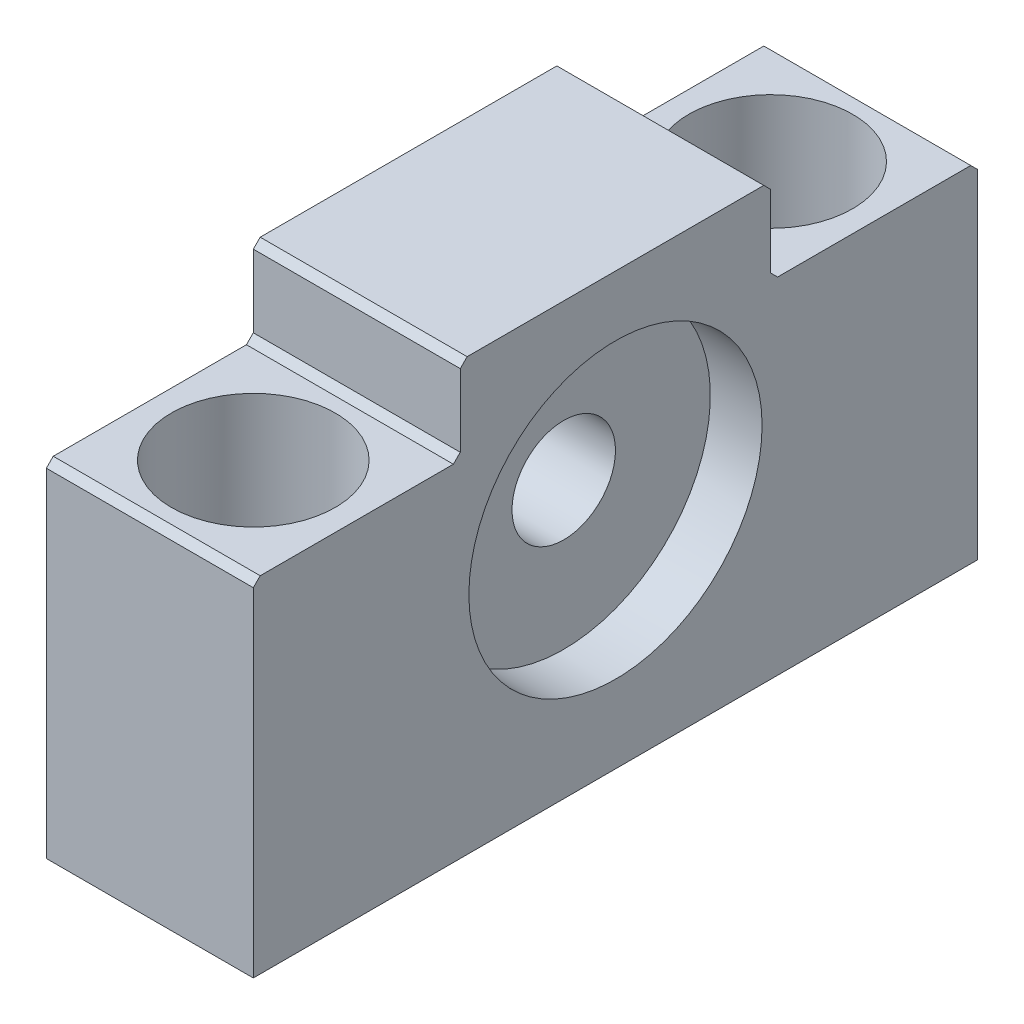
ISO-10303-21;
HEADER;
FILE_DESCRIPTION(('STEP AP214'),'2;1');
FILE_NAME('part.step','',(''),(''),'','','');
FILE_SCHEMA(('AUTOMOTIVE_DESIGN { 1 0 10303 214 1 1 1 1 }'));
ENDSEC;
DATA;
#1=APPLICATION_CONTEXT('core data for automotive mechanical design processes');
#2=APPLICATION_PROTOCOL_DEFINITION('international standard','automotive_design',2000,#1);
#3=PRODUCT_CONTEXT('',#1,'mechanical');
#4=PRODUCT('Part','Part','',(#3));
#5=PRODUCT_RELATED_PRODUCT_CATEGORY('part','',(#4));
#6=PRODUCT_DEFINITION_FORMATION('','',#4);
#7=PRODUCT_DEFINITION_CONTEXT('part definition',#1,'design');
#8=PRODUCT_DEFINITION('design','',#6,#7);
#9=PRODUCT_DEFINITION_SHAPE('','',#8);
#10=(LENGTH_UNIT() NAMED_UNIT(*) SI_UNIT(.MILLI.,.METRE.));
#11=(NAMED_UNIT(*) PLANE_ANGLE_UNIT() SI_UNIT($,.RADIAN.));
#12=(NAMED_UNIT(*) SI_UNIT($,.STERADIAN.) SOLID_ANGLE_UNIT());
#13=UNCERTAINTY_MEASURE_WITH_UNIT(LENGTH_MEASURE(1.E-05),#10,'distance_accuracy_value','');
#14=(GEOMETRIC_REPRESENTATION_CONTEXT(3) GLOBAL_UNCERTAINTY_ASSIGNED_CONTEXT((#13)) GLOBAL_UNIT_ASSIGNED_CONTEXT((#10,
#11,#12)) REPRESENTATION_CONTEXT('',''));
#15=CARTESIAN_POINT('',(0.,0.,0.));
#16=DIRECTION('',(0.,0.,1.));
#17=DIRECTION('',(1.,0.,0.));
#18=AXIS2_PLACEMENT_3D('',#15,#16,#17);
#19=CARTESIAN_POINT('',(0.,6.6,21.));
#20=DIRECTION('',(0.,0.707106781186548,0.707106781186547));
#21=DIRECTION('',(1.,0.,0.));
#22=AXIS2_PLACEMENT_3D('',#19,#20,#21);
#23=PLANE('',#22);
#24=DIRECTION('',(0.,-0.707106781186548,0.707106781186548));
#25=VECTOR('',#24,1.);
#26=CARTESIAN_POINT('',(0.,7.,20.6));
#27=LINE('',#26,#25);
#28=CARTESIAN_POINT('',(0.,7.,20.6));
#29=VERTEX_POINT('',#28);
#30=CARTESIAN_POINT('',(0.,6.6,21.));
#31=VERTEX_POINT('',#30);
#32=EDGE_CURVE('E120',#29,#31,#27,.T.);
#33=ORIENTED_EDGE('',*,*,#32,.T.);
#34=DIRECTION('',(1.,0.,0.));
#35=VECTOR('',#34,1.);
#36=CARTESIAN_POINT('',(0.,6.6,21.));
#37=LINE('',#36,#35);
#38=CARTESIAN_POINT('',(12.,6.6,21.));
#39=VERTEX_POINT('',#38);
#40=EDGE_CURVE('E134',#39,#31,#37,.F.);
#41=ORIENTED_EDGE('',*,*,#40,.F.);
#42=DIRECTION('',(0.,0.707106781186548,-0.707106781186548));
#43=VECTOR('',#42,1.);
#44=CARTESIAN_POINT('',(12.,6.6,21.));
#45=LINE('',#44,#43);
#46=CARTESIAN_POINT('',(12.,7.,20.6));
#47=VERTEX_POINT('',#46);
#48=EDGE_CURVE('E140',#47,#39,#45,.F.);
#49=ORIENTED_EDGE('',*,*,#48,.F.);
#50=DIRECTION('',(-1.,0.,0.));
#51=VECTOR('',#50,1.);
#52=CARTESIAN_POINT('',(12.,7.,20.6));
#53=LINE('',#52,#51);
#54=EDGE_CURVE('E128',#47,#29,#53,.T.);
#55=ORIENTED_EDGE('',*,*,#54,.T.);
#56=EDGE_LOOP('',(#33,#41,#49,#55));
#57=FACE_BOUND('',#56,.T.);
#58=ADVANCED_FACE('F17',(#57),#23,.T.);
#59=CARTESIAN_POINT('',(12.,-13.,21.));
#60=DIRECTION('',(0.,0.,1.));
#61=DIRECTION('',(0.,1.,0.));
#62=AXIS2_PLACEMENT_3D('',#59,#60,#61);
#63=PLANE('',#62);
#64=DIRECTION('',(0.,-1.,0.));
#65=VECTOR('',#64,1.);
#66=CARTESIAN_POINT('',(0.,6.6,21.));
#67=LINE('',#66,#65);
#68=CARTESIAN_POINT('',(0.,-13.,21.));
#69=VERTEX_POINT('',#68);
#70=EDGE_CURVE('E116',#31,#69,#67,.T.);
#71=ORIENTED_EDGE('',*,*,#70,.T.);
#72=DIRECTION('',(1.,0.,0.));
#73=VECTOR('',#72,1.);
#74=CARTESIAN_POINT('',(0.,-13.,21.));
#75=LINE('',#74,#73);
#76=CARTESIAN_POINT('',(12.,-13.,21.));
#77=VERTEX_POINT('',#76);
#78=EDGE_CURVE('E127',#77,#69,#75,.F.);
#79=ORIENTED_EDGE('',*,*,#78,.F.);
#80=DIRECTION('',(0.,1.,0.));
#81=VECTOR('',#80,1.);
#82=CARTESIAN_POINT('',(12.,-13.,21.));
#83=LINE('',#82,#81);
#84=EDGE_CURVE('E139',#39,#77,#83,.F.);
#85=ORIENTED_EDGE('',*,*,#84,.F.);
#86=ORIENTED_EDGE('',*,*,#40,.T.);
#87=EDGE_LOOP('',(#71,#79,#85,#86));
#88=FACE_BOUND('',#87,.T.);
#89=ADVANCED_FACE('F138',(#88),#63,.T.);
#90=CARTESIAN_POINT('',(0.,-13.,-21.));
#91=DIRECTION('',(0.,-1.,0.));
#92=DIRECTION('',(1.,0.,0.));
#93=AXIS2_PLACEMENT_3D('',#90,#91,#92);
#94=PLANE('',#93);
#95=DIRECTION('',(0.,0.,-1.));
#96=VECTOR('',#95,1.);
#97=CARTESIAN_POINT('',(0.,-13.,21.));
#98=LINE('',#97,#96);
#99=CARTESIAN_POINT('',(0.,-13.,-21.));
#100=VERTEX_POINT('',#99);
#101=EDGE_CURVE('E122',#69,#100,#98,.T.);
#102=ORIENTED_EDGE('',*,*,#101,.T.);
#103=DIRECTION('',(1.,0.,0.));
#104=VECTOR('',#103,1.);
#105=CARTESIAN_POINT('',(0.,-13.,-21.));
#106=LINE('',#105,#104);
#107=CARTESIAN_POINT('',(12.,-13.,-21.));
#108=VERTEX_POINT('',#107);
#109=EDGE_CURVE('E162',#108,#100,#106,.F.);
#110=ORIENTED_EDGE('',*,*,#109,.F.);
#111=DIRECTION('',(0.,0.,1.));
#112=VECTOR('',#111,1.);
#113=CARTESIAN_POINT('',(12.,-13.,-21.));
#114=LINE('',#113,#112);
#115=EDGE_CURVE('E167',#77,#108,#114,.F.);
#116=ORIENTED_EDGE('',*,*,#115,.F.);
#117=ORIENTED_EDGE('',*,*,#78,.T.);
#118=EDGE_LOOP('',(#102,#110,#116,#117));
#119=FACE_BOUND('',#118,.T.);
#120=CARTESIAN_POINT('',(6.,-13.,-15.));
#121=DIRECTION('',(0.,1.,0.));
#122=DIRECTION('',(0.,0.,-1.));
#123=AXIS2_PLACEMENT_3D('',#120,#121,#122);
#124=CIRCLE('',#123,2.75);
#125=CARTESIAN_POINT('',(6.,-13.,-17.75));
#126=VERTEX_POINT('',#125);
#127=EDGE_CURVE('E171',#126,#126,#124,.F.);
#128=ORIENTED_EDGE('',*,*,#127,.F.);
#129=EDGE_LOOP('',(#128));
#130=FACE_BOUND('',#129,.T.);
#131=CARTESIAN_POINT('',(6.,-13.,15.));
#132=DIRECTION('',(0.,1.,0.));
#133=DIRECTION('',(0.,0.,-1.));
#134=AXIS2_PLACEMENT_3D('',#131,#132,#133);
#135=CIRCLE('',#134,2.75);
#136=CARTESIAN_POINT('',(6.,-13.,12.25));
#137=VERTEX_POINT('',#136);
#138=EDGE_CURVE('E176',#137,#137,#135,.F.);
#139=ORIENTED_EDGE('',*,*,#138,.F.);
#140=EDGE_LOOP('',(#139));
#141=FACE_BOUND('',#140,.T.);
#142=ADVANCED_FACE('F379',(#119,#130,#141),#94,.T.);
#143=CARTESIAN_POINT('',(0.,-13.,-21.));
#144=DIRECTION('',(0.,0.,-1.));
#145=DIRECTION('',(0.,1.,0.));
#146=AXIS2_PLACEMENT_3D('',#143,#144,#145);
#147=PLANE('',#146);
#148=DIRECTION('',(0.,1.,0.));
#149=VECTOR('',#148,1.);
#150=CARTESIAN_POINT('',(0.,-13.,-21.));
#151=LINE('',#150,#149);
#152=CARTESIAN_POINT('',(0.,6.6,-21.));
#153=VERTEX_POINT('',#152);
#154=EDGE_CURVE('E179',#100,#153,#151,.T.);
#155=ORIENTED_EDGE('',*,*,#154,.T.);
#156=DIRECTION('',(1.,0.,0.));
#157=VECTOR('',#156,1.);
#158=CARTESIAN_POINT('',(0.,6.6,-21.));
#159=LINE('',#158,#157);
#160=CARTESIAN_POINT('',(12.,6.6,-21.));
#161=VERTEX_POINT('',#160);
#162=EDGE_CURVE('E182',#161,#153,#159,.F.);
#163=ORIENTED_EDGE('',*,*,#162,.F.);
#164=DIRECTION('',(0.,-1.,0.));
#165=VECTOR('',#164,1.);
#166=CARTESIAN_POINT('',(12.,6.6,-21.));
#167=LINE('',#166,#165);
#168=EDGE_CURVE('E187',#108,#161,#167,.F.);
#169=ORIENTED_EDGE('',*,*,#168,.F.);
#170=ORIENTED_EDGE('',*,*,#109,.T.);
#171=EDGE_LOOP('',(#155,#163,#169,#170));
#172=FACE_BOUND('',#171,.T.);
#173=ADVANCED_FACE('F384',(#172),#147,.T.);
#174=CARTESIAN_POINT('',(0.,7.,-20.6));
#175=DIRECTION('',(0.,0.707106781186548,-0.707106781186547));
#176=DIRECTION('',(1.,0.,0.));
#177=AXIS2_PLACEMENT_3D('',#174,#175,#176);
#178=PLANE('',#177);
#179=DIRECTION('',(0.,0.707106781186548,0.707106781186547));
#180=VECTOR('',#179,1.);
#181=CARTESIAN_POINT('',(0.,6.6,-21.));
#182=LINE('',#181,#180);
#183=CARTESIAN_POINT('',(0.,7.,-20.6));
#184=VERTEX_POINT('',#183);
#185=EDGE_CURVE('E191',#153,#184,#182,.T.);
#186=ORIENTED_EDGE('',*,*,#185,.T.);
#187=DIRECTION('',(1.,0.,0.));
#188=VECTOR('',#187,1.);
#189=CARTESIAN_POINT('',(0.,7.,-20.6));
#190=LINE('',#189,#188);
#191=CARTESIAN_POINT('',(12.,7.,-20.6));
#192=VERTEX_POINT('',#191);
#193=EDGE_CURVE('E196',#192,#184,#190,.F.);
#194=ORIENTED_EDGE('',*,*,#193,.F.);
#195=DIRECTION('',(0.,-0.707106781186549,-0.707106781186546));
#196=VECTOR('',#195,1.);
#197=CARTESIAN_POINT('',(12.,7.,-20.6));
#198=LINE('',#197,#196);
#199=EDGE_CURVE('E201',#161,#192,#198,.F.);
#200=ORIENTED_EDGE('',*,*,#199,.F.);
#201=ORIENTED_EDGE('',*,*,#162,.T.);
#202=EDGE_LOOP('',(#186,#194,#200,#201));
#203=FACE_BOUND('',#202,.T.);
#204=ADVANCED_FACE('F388',(#203),#178,.T.);
#205=CARTESIAN_POINT('',(0.,7.,-9.4));
#206=DIRECTION('',(0.,1.,0.));
#207=DIRECTION('',(1.,0.,0.));
#208=AXIS2_PLACEMENT_3D('',#205,#206,#207);
#209=PLANE('',#208);
#210=DIRECTION('',(0.,0.,1.));
#211=VECTOR('',#210,1.);
#212=CARTESIAN_POINT('',(0.,7.,-20.6));
#213=LINE('',#212,#211);
#214=CARTESIAN_POINT('',(0.,7.,-9.4));
#215=VERTEX_POINT('',#214);
#216=EDGE_CURVE('E205',#184,#215,#213,.T.);
#217=ORIENTED_EDGE('',*,*,#216,.T.);
#218=DIRECTION('',(1.,0.,0.));
#219=VECTOR('',#218,1.);
#220=CARTESIAN_POINT('',(0.,7.,-9.4));
#221=LINE('',#220,#219);
#222=CARTESIAN_POINT('',(12.,7.,-9.4));
#223=VERTEX_POINT('',#222);
#224=EDGE_CURVE('E210',#223,#215,#221,.F.);
#225=ORIENTED_EDGE('',*,*,#224,.F.);
#226=DIRECTION('',(0.,0.,-1.));
#227=VECTOR('',#226,1.);
#228=CARTESIAN_POINT('',(12.,7.,-9.4));
#229=LINE('',#228,#227);
#230=EDGE_CURVE('E215',#192,#223,#229,.F.);
#231=ORIENTED_EDGE('',*,*,#230,.F.);
#232=ORIENTED_EDGE('',*,*,#193,.T.);
#233=EDGE_LOOP('',(#217,#225,#231,#232));
#234=FACE_BOUND('',#233,.T.);
#235=CARTESIAN_POINT('',(6.,7.,-15.));
#236=DIRECTION('',(0.,-1.,0.));
#237=DIRECTION('',(0.,0.,1.));
#238=AXIS2_PLACEMENT_3D('',#235,#236,#237);
#239=CIRCLE('',#238,4.75);
#240=CARTESIAN_POINT('',(6.,7.,-10.25));
#241=VERTEX_POINT('',#240);
#242=EDGE_CURVE('E219',#241,#241,#239,.T.);
#243=ORIENTED_EDGE('',*,*,#242,.T.);
#244=EDGE_LOOP('',(#243));
#245=FACE_BOUND('',#244,.T.);
#246=ADVANCED_FACE('F392',(#234,#245),#209,.T.);
#247=CARTESIAN_POINT('',(0.,7.4,-9.));
#248=DIRECTION('',(0.,0.707106781186547,-0.707106781186548));
#249=DIRECTION('',(1.,0.,0.));
#250=AXIS2_PLACEMENT_3D('',#247,#248,#249);
#251=PLANE('',#250);
#252=DIRECTION('',(0.,0.707106781186547,0.707106781186548));
#253=VECTOR('',#252,1.);
#254=CARTESIAN_POINT('',(0.,7.,-9.4));
#255=LINE('',#254,#253);
#256=CARTESIAN_POINT('',(0.,7.4,-9.));
#257=VERTEX_POINT('',#256);
#258=EDGE_CURVE('E224',#215,#257,#255,.T.);
#259=ORIENTED_EDGE('',*,*,#258,.T.);
#260=DIRECTION('',(1.,0.,0.));
#261=VECTOR('',#260,1.);
#262=CARTESIAN_POINT('',(0.,7.4,-9.));
#263=LINE('',#262,#261);
#264=CARTESIAN_POINT('',(12.,7.4,-9.));
#265=VERTEX_POINT('',#264);
#266=EDGE_CURVE('E227',#265,#257,#263,.F.);
#267=ORIENTED_EDGE('',*,*,#266,.F.);
#268=DIRECTION('',(0.,-0.707106781186548,-0.707106781186548));
#269=VECTOR('',#268,1.);
#270=CARTESIAN_POINT('',(12.,7.4,-9.));
#271=LINE('',#270,#269);
#272=EDGE_CURVE('E232',#223,#265,#271,.F.);
#273=ORIENTED_EDGE('',*,*,#272,.F.);
#274=ORIENTED_EDGE('',*,*,#224,.T.);
#275=EDGE_LOOP('',(#259,#267,#273,#274));
#276=FACE_BOUND('',#275,.T.);
#277=ADVANCED_FACE('F396',(#276),#251,.T.);
#278=CARTESIAN_POINT('',(0.,7.4,-9.));
#279=DIRECTION('',(0.,0.,-1.));
#280=DIRECTION('',(0.,1.,0.));
#281=AXIS2_PLACEMENT_3D('',#278,#279,#280);
#282=PLANE('',#281);
#283=DIRECTION('',(0.,1.,0.));
#284=VECTOR('',#283,1.);
#285=CARTESIAN_POINT('',(0.,7.4,-9.));
#286=LINE('',#285,#284);
#287=CARTESIAN_POINT('',(0.,11.6,-9.));
#288=VERTEX_POINT('',#287);
#289=EDGE_CURVE('E236',#257,#288,#286,.T.);
#290=ORIENTED_EDGE('',*,*,#289,.T.);
#291=DIRECTION('',(1.,0.,0.));
#292=VECTOR('',#291,1.);
#293=CARTESIAN_POINT('',(0.,11.6,-9.));
#294=LINE('',#293,#292);
#295=CARTESIAN_POINT('',(12.,11.6,-9.));
#296=VERTEX_POINT('',#295);
#297=EDGE_CURVE('E241',#296,#288,#294,.F.);
#298=ORIENTED_EDGE('',*,*,#297,.F.);
#299=DIRECTION('',(0.,-1.,0.));
#300=VECTOR('',#299,1.);
#301=CARTESIAN_POINT('',(12.,11.6,-9.));
#302=LINE('',#301,#300);
#303=EDGE_CURVE('E246',#265,#296,#302,.F.);
#304=ORIENTED_EDGE('',*,*,#303,.F.);
#305=ORIENTED_EDGE('',*,*,#266,.T.);
#306=EDGE_LOOP('',(#290,#298,#304,#305));
#307=FACE_BOUND('',#306,.T.);
#308=ADVANCED_FACE('F400',(#307),#282,.T.);
#309=CARTESIAN_POINT('',(0.,12.,-8.6));
#310=DIRECTION('',(0.,0.707106781186548,-0.707106781186548));
#311=DIRECTION('',(1.,0.,0.));
#312=AXIS2_PLACEMENT_3D('',#309,#310,#311);
#313=PLANE('',#312);
#314=DIRECTION('',(0.,0.707106781186548,0.707106781186548));
#315=VECTOR('',#314,1.);
#316=CARTESIAN_POINT('',(0.,11.6,-9.));
#317=LINE('',#316,#315);
#318=CARTESIAN_POINT('',(0.,12.,-8.6));
#319=VERTEX_POINT('',#318);
#320=EDGE_CURVE('E250',#288,#319,#317,.T.);
#321=ORIENTED_EDGE('',*,*,#320,.T.);
#322=DIRECTION('',(1.,0.,0.));
#323=VECTOR('',#322,1.);
#324=CARTESIAN_POINT('',(0.,12.,-8.6));
#325=LINE('',#324,#323);
#326=CARTESIAN_POINT('',(12.,12.,-8.6));
#327=VERTEX_POINT('',#326);
#328=EDGE_CURVE('E255',#327,#319,#325,.F.);
#329=ORIENTED_EDGE('',*,*,#328,.F.);
#330=DIRECTION('',(0.,-0.707106781186548,-0.707106781186548));
#331=VECTOR('',#330,1.);
#332=CARTESIAN_POINT('',(12.,12.,-8.6));
#333=LINE('',#332,#331);
#334=EDGE_CURVE('E260',#296,#327,#333,.F.);
#335=ORIENTED_EDGE('',*,*,#334,.F.);
#336=ORIENTED_EDGE('',*,*,#297,.T.);
#337=EDGE_LOOP('',(#321,#329,#335,#336));
#338=FACE_BOUND('',#337,.T.);
#339=ADVANCED_FACE('F404',(#338),#313,.T.);
#340=CARTESIAN_POINT('',(0.,12.,8.6));
#341=DIRECTION('',(0.,1.,0.));
#342=DIRECTION('',(1.,0.,0.));
#343=AXIS2_PLACEMENT_3D('',#340,#341,#342);
#344=PLANE('',#343);
#345=DIRECTION('',(0.,0.,1.));
#346=VECTOR('',#345,1.);
#347=CARTESIAN_POINT('',(0.,12.,-8.6));
#348=LINE('',#347,#346);
#349=CARTESIAN_POINT('',(0.,12.,8.6));
#350=VERTEX_POINT('',#349);
#351=EDGE_CURVE('E264',#319,#350,#348,.T.);
#352=ORIENTED_EDGE('',*,*,#351,.T.);
#353=DIRECTION('',(1.,0.,0.));
#354=VECTOR('',#353,1.);
#355=CARTESIAN_POINT('',(0.,12.,8.6));
#356=LINE('',#355,#354);
#357=CARTESIAN_POINT('',(12.,12.,8.6));
#358=VERTEX_POINT('',#357);
#359=EDGE_CURVE('E269',#358,#350,#356,.F.);
#360=ORIENTED_EDGE('',*,*,#359,.F.);
#361=DIRECTION('',(0.,0.,-1.));
#362=VECTOR('',#361,1.);
#363=CARTESIAN_POINT('',(12.,12.,8.6));
#364=LINE('',#363,#362);
#365=EDGE_CURVE('E274',#327,#358,#364,.F.);
#366=ORIENTED_EDGE('',*,*,#365,.F.);
#367=ORIENTED_EDGE('',*,*,#328,.T.);
#368=EDGE_LOOP('',(#352,#360,#366,#367));
#369=FACE_BOUND('',#368,.T.);
#370=ADVANCED_FACE('F408',(#369),#344,.T.);
#371=CARTESIAN_POINT('',(0.,11.6,9.));
#372=DIRECTION('',(0.,0.707106781186548,0.707106781186548));
#373=DIRECTION('',(1.,0.,0.));
#374=AXIS2_PLACEMENT_3D('',#371,#372,#373);
#375=PLANE('',#374);
#376=DIRECTION('',(0.,-0.707106781186548,0.707106781186548));
#377=VECTOR('',#376,1.);
#378=CARTESIAN_POINT('',(0.,12.,8.6));
#379=LINE('',#378,#377);
#380=CARTESIAN_POINT('',(0.,11.6,9.));
#381=VERTEX_POINT('',#380);
#382=EDGE_CURVE('E278',#350,#381,#379,.T.);
#383=ORIENTED_EDGE('',*,*,#382,.T.);
#384=DIRECTION('',(1.,0.,0.));
#385=VECTOR('',#384,1.);
#386=CARTESIAN_POINT('',(0.,11.6,9.));
#387=LINE('',#386,#385);
#388=CARTESIAN_POINT('',(12.,11.6,9.));
#389=VERTEX_POINT('',#388);
#390=EDGE_CURVE('E283',#389,#381,#387,.F.);
#391=ORIENTED_EDGE('',*,*,#390,.F.);
#392=DIRECTION('',(0.,0.707106781186548,-0.707106781186548));
#393=VECTOR('',#392,1.);
#394=CARTESIAN_POINT('',(12.,11.6,9.));
#395=LINE('',#394,#393);
#396=EDGE_CURVE('E288',#358,#389,#395,.F.);
#397=ORIENTED_EDGE('',*,*,#396,.F.);
#398=ORIENTED_EDGE('',*,*,#359,.T.);
#399=EDGE_LOOP('',(#383,#391,#397,#398));
#400=FACE_BOUND('',#399,.T.);
#401=ADVANCED_FACE('F412',(#400),#375,.T.);
#402=CARTESIAN_POINT('',(12.,7.4,9.));
#403=DIRECTION('',(0.,0.,1.));
#404=DIRECTION('',(0.,1.,0.));
#405=AXIS2_PLACEMENT_3D('',#402,#403,#404);
#406=PLANE('',#405);
#407=DIRECTION('',(0.,-1.,0.));
#408=VECTOR('',#407,1.);
#409=CARTESIAN_POINT('',(0.,11.6,9.));
#410=LINE('',#409,#408);
#411=CARTESIAN_POINT('',(0.,7.4,9.));
#412=VERTEX_POINT('',#411);
#413=EDGE_CURVE('E292',#381,#412,#410,.T.);
#414=ORIENTED_EDGE('',*,*,#413,.T.);
#415=DIRECTION('',(1.,0.,0.));
#416=VECTOR('',#415,1.);
#417=CARTESIAN_POINT('',(0.,7.4,9.));
#418=LINE('',#417,#416);
#419=CARTESIAN_POINT('',(12.,7.4,9.));
#420=VERTEX_POINT('',#419);
#421=EDGE_CURVE('E297',#420,#412,#418,.F.);
#422=ORIENTED_EDGE('',*,*,#421,.F.);
#423=DIRECTION('',(0.,1.,0.));
#424=VECTOR('',#423,1.);
#425=CARTESIAN_POINT('',(12.,7.4,9.));
#426=LINE('',#425,#424);
#427=EDGE_CURVE('E302',#389,#420,#426,.F.);
#428=ORIENTED_EDGE('',*,*,#427,.F.);
#429=ORIENTED_EDGE('',*,*,#390,.T.);
#430=EDGE_LOOP('',(#414,#422,#428,#429));
#431=FACE_BOUND('',#430,.T.);
#432=ADVANCED_FACE('F416',(#431),#406,.T.);
#433=CARTESIAN_POINT('',(0.,7.,9.4));
#434=DIRECTION('',(0.,0.707106781186547,0.707106781186548));
#435=DIRECTION('',(1.,0.,0.));
#436=AXIS2_PLACEMENT_3D('',#433,#434,#435);
#437=PLANE('',#436);
#438=DIRECTION('',(0.,-0.707106781186548,0.707106781186547));
#439=VECTOR('',#438,1.);
#440=CARTESIAN_POINT('',(0.,7.4,9.));
#441=LINE('',#440,#439);
#442=CARTESIAN_POINT('',(0.,7.,9.4));
#443=VERTEX_POINT('',#442);
#444=EDGE_CURVE('E306',#412,#443,#441,.T.);
#445=ORIENTED_EDGE('',*,*,#444,.T.);
#446=DIRECTION('',(1.,0.,0.));
#447=VECTOR('',#446,1.);
#448=CARTESIAN_POINT('',(0.,7.,9.4));
#449=LINE('',#448,#447);
#450=CARTESIAN_POINT('',(12.,7.,9.4));
#451=VERTEX_POINT('',#450);
#452=EDGE_CURVE('E310',#451,#443,#449,.F.);
#453=ORIENTED_EDGE('',*,*,#452,.F.);
#454=DIRECTION('',(0.,0.707106781186548,-0.707106781186548));
#455=VECTOR('',#454,1.);
#456=CARTESIAN_POINT('',(12.,7.,9.4));
#457=LINE('',#456,#455);
#458=EDGE_CURVE('E32',#420,#451,#457,.F.);
#459=ORIENTED_EDGE('',*,*,#458,.F.);
#460=ORIENTED_EDGE('',*,*,#421,.T.);
#461=EDGE_LOOP('',(#445,#453,#459,#460));
#462=FACE_BOUND('',#461,.T.);
#463=ADVANCED_FACE('F420',(#462),#437,.T.);
#464=CARTESIAN_POINT('',(0.,7.,20.6));
#465=DIRECTION('',(0.,1.,0.));
#466=DIRECTION('',(1.,0.,0.));
#467=AXIS2_PLACEMENT_3D('',#464,#465,#466);
#468=PLANE('',#467);
#469=DIRECTION('',(0.,0.,1.));
#470=VECTOR('',#469,1.);
#471=CARTESIAN_POINT('',(0.,7.,9.4));
#472=LINE('',#471,#470);
#473=EDGE_CURVE('E40',#443,#29,#472,.T.);
#474=ORIENTED_EDGE('',*,*,#473,.T.);
#475=ORIENTED_EDGE('',*,*,#54,.F.);
#476=DIRECTION('',(0.,0.,-1.));
#477=VECTOR('',#476,1.);
#478=CARTESIAN_POINT('',(12.,7.,20.6));
#479=LINE('',#478,#477);
#480=EDGE_CURVE('E321',#451,#47,#479,.F.);
#481=ORIENTED_EDGE('',*,*,#480,.F.);
#482=ORIENTED_EDGE('',*,*,#452,.T.);
#483=EDGE_LOOP('',(#474,#475,#481,#482));
#484=FACE_BOUND('',#483,.T.);
#485=CARTESIAN_POINT('',(6.,7.,15.));
#486=DIRECTION('',(0.,-1.,0.));
#487=DIRECTION('',(-1.42164429468339E-07,0.,0.99999999999999));
#488=AXIS2_PLACEMENT_3D('',#485,#486,#487);
#489=CIRCLE('',#488,4.75);
#490=CARTESIAN_POINT('',(5.99999932471896,7.,19.75));
#491=VERTEX_POINT('',#490);
#492=EDGE_CURVE('E325',#491,#491,#489,.T.);
#493=ORIENTED_EDGE('',*,*,#492,.T.);
#494=EDGE_LOOP('',(#493));
#495=FACE_BOUND('',#494,.T.);
#496=ADVANCED_FACE('F424',(#484,#495),#468,.T.);
#497=CARTESIAN_POINT('',(12.,-13.,-21.));
#498=DIRECTION('',(1.,0.,0.));
#499=DIRECTION('',(0.,1.,0.));
#500=AXIS2_PLACEMENT_3D('',#497,#498,#499);
#501=PLANE('',#500);
#502=ORIENTED_EDGE('',*,*,#48,.T.);
#503=ORIENTED_EDGE('',*,*,#84,.T.);
#504=ORIENTED_EDGE('',*,*,#115,.T.);
#505=ORIENTED_EDGE('',*,*,#168,.T.);
#506=ORIENTED_EDGE('',*,*,#199,.T.);
#507=ORIENTED_EDGE('',*,*,#230,.T.);
#508=ORIENTED_EDGE('',*,*,#272,.T.);
#509=ORIENTED_EDGE('',*,*,#303,.T.);
#510=ORIENTED_EDGE('',*,*,#334,.T.);
#511=ORIENTED_EDGE('',*,*,#365,.T.);
#512=ORIENTED_EDGE('',*,*,#396,.T.);
#513=ORIENTED_EDGE('',*,*,#427,.T.);
#514=ORIENTED_EDGE('',*,*,#458,.T.);
#515=ORIENTED_EDGE('',*,*,#480,.T.);
#516=EDGE_LOOP('',(#502,#503,#504,#505,#506,#507,#508,#509,#510,#511,#512,#513,#514,#515));
#517=FACE_BOUND('',#516,.T.);
#518=CARTESIAN_POINT('',(12.,0.,0.));
#519=DIRECTION('',(-1.,0.,0.));
#520=DIRECTION('',(0.,0.,-1.));
#521=AXIS2_PLACEMENT_3D('',#518,#519,#520);
#522=CIRCLE('',#521,8.5);
#523=CARTESIAN_POINT('',(12.,0.,-8.5));
#524=VERTEX_POINT('',#523);
#525=EDGE_CURVE('E330',#524,#524,#522,.F.);
#526=ORIENTED_EDGE('',*,*,#525,.F.);
#527=EDGE_LOOP('',(#526));
#528=FACE_BOUND('',#527,.T.);
#529=ADVANCED_FACE('F428',(#517,#528),#501,.T.);
#530=CARTESIAN_POINT('',(0.,-13.,-21.));
#531=DIRECTION('',(-1.,0.,0.));
#532=DIRECTION('',(0.,0.,1.));
#533=AXIS2_PLACEMENT_3D('',#530,#531,#532);
#534=PLANE('',#533);
#535=ORIENTED_EDGE('',*,*,#32,.F.);
#536=ORIENTED_EDGE('',*,*,#473,.F.);
#537=ORIENTED_EDGE('',*,*,#444,.F.);
#538=ORIENTED_EDGE('',*,*,#413,.F.);
#539=ORIENTED_EDGE('',*,*,#382,.F.);
#540=ORIENTED_EDGE('',*,*,#351,.F.);
#541=ORIENTED_EDGE('',*,*,#320,.F.);
#542=ORIENTED_EDGE('',*,*,#289,.F.);
#543=ORIENTED_EDGE('',*,*,#258,.F.);
#544=ORIENTED_EDGE('',*,*,#216,.F.);
#545=ORIENTED_EDGE('',*,*,#185,.F.);
#546=ORIENTED_EDGE('',*,*,#154,.F.);
#547=ORIENTED_EDGE('',*,*,#101,.F.);
#548=ORIENTED_EDGE('',*,*,#70,.F.);
#549=EDGE_LOOP('',(#535,#536,#537,#538,#539,#540,#541,#542,#543,#544,#545,#546,#547,#548));
#550=FACE_BOUND('',#549,.T.);
#551=CARTESIAN_POINT('',(0.,0.,0.));
#552=DIRECTION('',(1.,0.,0.));
#553=DIRECTION('',(0.,-1.16842149027969E-09,1.));
#554=AXIS2_PLACEMENT_3D('',#551,#552,#553);
#555=CIRCLE('',#554,8.5);
#556=CARTESIAN_POINT('',(0.,-9.93158266737736E-09,8.5));
#557=VERTEX_POINT('',#556);
#558=EDGE_CURVE('E333',#557,#557,#555,.T.);
#559=ORIENTED_EDGE('',*,*,#558,.T.);
#560=EDGE_LOOP('',(#559));
#561=FACE_BOUND('',#560,.T.);
#562=ADVANCED_FACE('F118',(#550,#561),#534,.T.);
#563=CARTESIAN_POINT('',(3.,-8.73225364009987,-8.5));
#564=DIRECTION('',(-1.,0.,0.));
#565=DIRECTION('',(0.,0.,1.));
#566=AXIS2_PLACEMENT_3D('',#563,#564,#565);
#567=PLANE('',#566);
#568=CARTESIAN_POINT('',(3.,0.,0.));
#569=DIRECTION('',(-1.,0.,0.));
#570=DIRECTION('',(0.,0.,-1.));
#571=AXIS2_PLACEMENT_3D('',#568,#569,#570);
#572=CIRCLE('',#571,8.5);
#573=CARTESIAN_POINT('',(3.,0.,-8.5));
#574=VERTEX_POINT('',#573);
#575=EDGE_CURVE('E336',#574,#574,#572,.F.);
#576=ORIENTED_EDGE('',*,*,#575,.F.);
#577=EDGE_LOOP('',(#576));
#578=FACE_BOUND('',#577,.T.);
#579=CARTESIAN_POINT('',(3.,0.,0.));
#580=DIRECTION('',(1.,0.,0.));
#581=DIRECTION('',(0.,0.,1.));
#582=AXIS2_PLACEMENT_3D('',#579,#580,#581);
#583=CIRCLE('',#582,3.);
#584=CARTESIAN_POINT('',(3.,0.,3.));
#585=VERTEX_POINT('',#584);
#586=EDGE_CURVE('E339',#585,#585,#583,.T.);
#587=ORIENTED_EDGE('',*,*,#586,.T.);
#588=EDGE_LOOP('',(#587));
#589=FACE_BOUND('',#588,.T.);
#590=ADVANCED_FACE('F434',(#578,#589),#567,.T.);
#591=CARTESIAN_POINT('',(9.,-8.73225362560405,8.5));
#592=DIRECTION('',(1.,0.,0.));
#593=DIRECTION('',(0.,0.,-1.));
#594=AXIS2_PLACEMENT_3D('',#591,#592,#593);
#595=PLANE('',#594);
#596=CARTESIAN_POINT('',(9.,0.,0.));
#597=DIRECTION('',(1.,0.,0.));
#598=DIRECTION('',(0.,-1.16842128129653E-09,1.));
#599=AXIS2_PLACEMENT_3D('',#596,#597,#598);
#600=CIRCLE('',#599,8.5);
#601=CARTESIAN_POINT('',(9.,-9.93158089102053E-09,8.5));
#602=VERTEX_POINT('',#601);
#603=EDGE_CURVE('E342',#602,#602,#600,.T.);
#604=ORIENTED_EDGE('',*,*,#603,.T.);
#605=EDGE_LOOP('',(#604));
#606=FACE_BOUND('',#605,.T.);
#607=CARTESIAN_POINT('',(9.,0.,0.));
#608=DIRECTION('',(-1.,0.,0.));
#609=DIRECTION('',(0.,0.,-1.));
#610=AXIS2_PLACEMENT_3D('',#607,#608,#609);
#611=CIRCLE('',#610,3.);
#612=CARTESIAN_POINT('',(9.,0.,-3.));
#613=VERTEX_POINT('',#612);
#614=EDGE_CURVE('E345',#613,#613,#611,.F.);
#615=ORIENTED_EDGE('',*,*,#614,.F.);
#616=EDGE_LOOP('',(#615));
#617=FACE_BOUND('',#616,.T.);
#618=ADVANCED_FACE('F437',(#606,#617),#595,.T.);
#619=CARTESIAN_POINT('',(1.25,-4.,-19.75));
#620=DIRECTION('',(0.,1.,0.));
#621=DIRECTION('',(0.,0.,1.));
#622=AXIS2_PLACEMENT_3D('',#619,#620,#621);
#623=PLANE('',#622);
#624=CARTESIAN_POINT('',(6.,-4.,-15.));
#625=DIRECTION('',(0.,1.,0.));
#626=DIRECTION('',(0.,0.,-1.));
#627=AXIS2_PLACEMENT_3D('',#624,#625,#626);
#628=CIRCLE('',#627,4.75);
#629=CARTESIAN_POINT('',(6.,-4.,-19.75));
#630=VERTEX_POINT('',#629);
#631=EDGE_CURVE('E348',#630,#630,#628,.F.);
#632=ORIENTED_EDGE('',*,*,#631,.F.);
#633=EDGE_LOOP('',(#632));
#634=FACE_BOUND('',#633,.T.);
#635=CARTESIAN_POINT('',(6.,-4.,-15.));
#636=DIRECTION('',(0.,-1.,0.));
#637=DIRECTION('',(0.,0.,1.));
#638=AXIS2_PLACEMENT_3D('',#635,#636,#637);
#639=CIRCLE('',#638,2.75);
#640=CARTESIAN_POINT('',(6.,-4.,-12.25));
#641=VERTEX_POINT('',#640);
#642=EDGE_CURVE('E351',#641,#641,#639,.T.);
#643=ORIENTED_EDGE('',*,*,#642,.T.);
#644=EDGE_LOOP('',(#643));
#645=FACE_BOUND('',#644,.T.);
#646=ADVANCED_FACE('F363',(#634,#645),#623,.T.);
#647=CARTESIAN_POINT('',(1.25,-4.,10.25));
#648=DIRECTION('',(0.,1.,0.));
#649=DIRECTION('',(0.,0.,1.));
#650=AXIS2_PLACEMENT_3D('',#647,#648,#649);
#651=PLANE('',#650);
#652=CARTESIAN_POINT('',(6.,-4.,15.));
#653=DIRECTION('',(0.,1.,0.));
#654=DIRECTION('',(0.,0.,-1.));
#655=AXIS2_PLACEMENT_3D('',#652,#653,#654);
#656=CIRCLE('',#655,4.75);
#657=CARTESIAN_POINT('',(6.,-4.,10.25));
#658=VERTEX_POINT('',#657);
#659=EDGE_CURVE('E25',#658,#658,#656,.F.);
#660=ORIENTED_EDGE('',*,*,#659,.F.);
#661=EDGE_LOOP('',(#660));
#662=FACE_BOUND('',#661,.T.);
#663=CARTESIAN_POINT('',(6.,-4.,15.));
#664=DIRECTION('',(0.,-1.,0.));
#665=DIRECTION('',(0.,0.,1.));
#666=AXIS2_PLACEMENT_3D('',#663,#664,#665);
#667=CIRCLE('',#666,2.75);
#668=CARTESIAN_POINT('',(6.,-4.,17.75));
#669=VERTEX_POINT('',#668);
#670=EDGE_CURVE('E11',#669,#669,#667,.T.);
#671=ORIENTED_EDGE('',*,*,#670,.T.);
#672=EDGE_LOOP('',(#671));
#673=FACE_BOUND('',#672,.T.);
#674=ADVANCED_FACE('F359',(#662,#673),#651,.T.);
#675=CARTESIAN_POINT('',(12.,0.,0.));
#676=DIRECTION('',(1.,0.,0.));
#677=DIRECTION('',(0.,0.,1.));
#678=AXIS2_PLACEMENT_3D('',#675,#676,#677);
#679=CYLINDRICAL_SURFACE('',#678,8.5);
#680=ORIENTED_EDGE('',*,*,#575,.T.);
#681=EDGE_LOOP('',(#680));
#682=FACE_BOUND('',#681,.T.);
#683=ORIENTED_EDGE('',*,*,#558,.F.);
#684=EDGE_LOOP('',(#683));
#685=FACE_BOUND('',#684,.T.);
#686=ADVANCED_FACE('F362',(#682,#685),#679,.F.);
#687=CARTESIAN_POINT('',(12.,0.,0.));
#688=DIRECTION('',(1.,0.,0.));
#689=DIRECTION('',(0.,0.,1.));
#690=AXIS2_PLACEMENT_3D('',#687,#688,#689);
#691=CYLINDRICAL_SURFACE('',#690,3.);
#692=ORIENTED_EDGE('',*,*,#614,.T.);
#693=EDGE_LOOP('',(#692));
#694=FACE_BOUND('',#693,.T.);
#695=ORIENTED_EDGE('',*,*,#586,.F.);
#696=EDGE_LOOP('',(#695));
#697=FACE_BOUND('',#696,.T.);
#698=ADVANCED_FACE('F447',(#694,#697),#691,.F.);
#699=CARTESIAN_POINT('',(12.,0.,0.));
#700=DIRECTION('',(1.,0.,0.));
#701=DIRECTION('',(0.,0.,1.));
#702=AXIS2_PLACEMENT_3D('',#699,#700,#701);
#703=CYLINDRICAL_SURFACE('',#702,8.5);
#704=ORIENTED_EDGE('',*,*,#525,.T.);
#705=EDGE_LOOP('',(#704));
#706=FACE_BOUND('',#705,.T.);
#707=ORIENTED_EDGE('',*,*,#603,.F.);
#708=EDGE_LOOP('',(#707));
#709=FACE_BOUND('',#708,.T.);
#710=ADVANCED_FACE('F451',(#706,#709),#703,.F.);
#711=CARTESIAN_POINT('',(6.,-13.,-15.));
#712=DIRECTION('',(0.,-1.,0.));
#713=DIRECTION('',(0.,0.,1.));
#714=AXIS2_PLACEMENT_3D('',#711,#712,#713);
#715=CYLINDRICAL_SURFACE('',#714,4.75);
#716=ORIENTED_EDGE('',*,*,#631,.T.);
#717=EDGE_LOOP('',(#716));
#718=FACE_BOUND('',#717,.T.);
#719=ORIENTED_EDGE('',*,*,#242,.F.);
#720=EDGE_LOOP('',(#719));
#721=FACE_BOUND('',#720,.T.);
#722=ADVANCED_FACE('F455',(#718,#721),#715,.F.);
#723=CARTESIAN_POINT('',(6.,-13.,-15.));
#724=DIRECTION('',(0.,-1.,0.));
#725=DIRECTION('',(1.42053896324052E-07,0.,0.99999999999999));
#726=AXIS2_PLACEMENT_3D('',#723,#724,#725);
#727=CYLINDRICAL_SURFACE('',#726,2.75);
#728=ORIENTED_EDGE('',*,*,#127,.T.);
#729=EDGE_LOOP('',(#728));
#730=FACE_BOUND('',#729,.T.);
#731=ORIENTED_EDGE('',*,*,#642,.F.);
#732=EDGE_LOOP('',(#731));
#733=FACE_BOUND('',#732,.T.);
#734=ADVANCED_FACE('F373',(#730,#733),#727,.F.);
#735=CARTESIAN_POINT('',(6.,-13.,15.));
#736=DIRECTION('',(0.,-1.,0.));
#737=DIRECTION('',(0.,0.,1.));
#738=AXIS2_PLACEMENT_3D('',#735,#736,#737);
#739=CYLINDRICAL_SURFACE('',#738,4.75);
#740=ORIENTED_EDGE('',*,*,#659,.T.);
#741=EDGE_LOOP('',(#740));
#742=FACE_BOUND('',#741,.T.);
#743=ORIENTED_EDGE('',*,*,#492,.F.);
#744=EDGE_LOOP('',(#743));
#745=FACE_BOUND('',#744,.T.);
#746=ADVANCED_FACE('F356',(#742,#745),#739,.F.);
#747=CARTESIAN_POINT('',(6.,-13.,15.));
#748=DIRECTION('',(0.,-1.,0.));
#749=DIRECTION('',(1.42053896324052E-07,0.,0.99999999999999));
#750=AXIS2_PLACEMENT_3D('',#747,#748,#749);
#751=CYLINDRICAL_SURFACE('',#750,2.75);
#752=ORIENTED_EDGE('',*,*,#138,.T.);
#753=EDGE_LOOP('',(#752));
#754=FACE_BOUND('',#753,.T.);
#755=ORIENTED_EDGE('',*,*,#670,.F.);
#756=EDGE_LOOP('',(#755));
#757=FACE_BOUND('',#756,.T.);
#758=ADVANCED_FACE('F19',(#754,#757),#751,.F.);
#759=CLOSED_SHELL('',(#58,#89,#142,#173,#204,#246,#277,#308,#339,#370,#401,#432,#463,#496,#529,
#562,#590,#618,#646,#674,#686,#698,#710,#722,#734,#746,#758));
#760=MANIFOLD_SOLID_BREP('B1',#759);
#761=ADVANCED_BREP_SHAPE_REPRESENTATION('',(#18,#760),#14);
#762=SHAPE_DEFINITION_REPRESENTATION(#9,#761);
ENDSEC;
END-ISO-10303-21;
